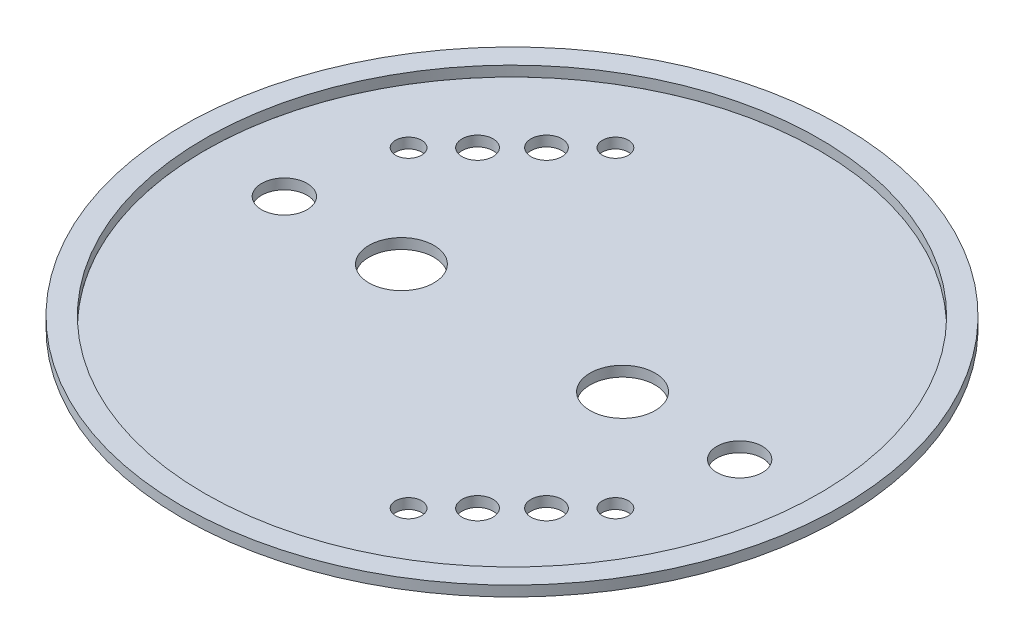
ISO-10303-21;
HEADER;
FILE_DESCRIPTION(('STEP AP214'),'2;1');
FILE_NAME('part.step','',(''),(''),'','','');
FILE_SCHEMA(('AUTOMOTIVE_DESIGN { 1 0 10303 214 1 1 1 1 }'));
ENDSEC;
DATA;
#1=APPLICATION_CONTEXT('core data for automotive mechanical design processes');
#2=APPLICATION_PROTOCOL_DEFINITION('international standard','automotive_design',2000,#1);
#3=PRODUCT_CONTEXT('',#1,'mechanical');
#4=PRODUCT('Part','Part','',(#3));
#5=PRODUCT_RELATED_PRODUCT_CATEGORY('part','',(#4));
#6=PRODUCT_DEFINITION_FORMATION('','',#4);
#7=PRODUCT_DEFINITION_CONTEXT('part definition',#1,'design');
#8=PRODUCT_DEFINITION('design','',#6,#7);
#9=PRODUCT_DEFINITION_SHAPE('','',#8);
#10=(LENGTH_UNIT() NAMED_UNIT(*) SI_UNIT(.MILLI.,.METRE.));
#11=(NAMED_UNIT(*) PLANE_ANGLE_UNIT() SI_UNIT($,.RADIAN.));
#12=(NAMED_UNIT(*) SI_UNIT($,.STERADIAN.) SOLID_ANGLE_UNIT());
#13=UNCERTAINTY_MEASURE_WITH_UNIT(LENGTH_MEASURE(1.E-05),#10,'distance_accuracy_value','');
#14=(GEOMETRIC_REPRESENTATION_CONTEXT(3) GLOBAL_UNCERTAINTY_ASSIGNED_CONTEXT((#13)) GLOBAL_UNIT_ASSIGNED_CONTEXT((#10,
#11,#12)) REPRESENTATION_CONTEXT('',''));
#15=CARTESIAN_POINT('',(0.,0.,0.));
#16=DIRECTION('',(0.,0.,1.));
#17=DIRECTION('',(1.,0.,0.));
#18=AXIS2_PLACEMENT_3D('',#15,#16,#17);
#19=CARTESIAN_POINT('',(0.,15.,0.));
#20=DIRECTION('',(0.,-1.,0.));
#21=DIRECTION('',(0.,0.,-1.));
#22=AXIS2_PLACEMENT_3D('',#19,#20,#21);
#23=CYLINDRICAL_SURFACE('',#22,76.);
#24=CARTESIAN_POINT('',(0.,7.5,0.));
#25=DIRECTION('',(0.,-1.,0.));
#26=DIRECTION('',(0.,0.,-1.));
#27=AXIS2_PLACEMENT_3D('',#24,#25,#26);
#28=CIRCLE('',#27,76.);
#29=CARTESIAN_POINT('',(0.,7.5,-76.));
#30=VERTEX_POINT('',#29);
#31=EDGE_CURVE('E59',#30,#30,#28,.T.);
#32=ORIENTED_EDGE('',*,*,#31,.F.);
#33=EDGE_LOOP('',(#32));
#34=FACE_BOUND('',#33,.T.);
#35=CARTESIAN_POINT('',(0.,9.88,0.));
#36=DIRECTION('',(0.,1.,0.));
#37=DIRECTION('',(0.,0.,1.));
#38=AXIS2_PLACEMENT_3D('',#35,#36,#37);
#39=CIRCLE('',#38,76.);
#40=CARTESIAN_POINT('',(0.,9.88,76.));
#41=VERTEX_POINT('',#40);
#42=EDGE_CURVE('E65',#41,#41,#39,.T.);
#43=ORIENTED_EDGE('',*,*,#42,.F.);
#44=EDGE_LOOP('',(#43));
#45=FACE_BOUND('',#44,.T.);
#46=ADVANCED_FACE('F51',(#34,#45),#23,.T.);
#47=CARTESIAN_POINT('',(0.,7.5,0.));
#48=DIRECTION('',(0.,1.,0.));
#49=DIRECTION('',(0.,0.,1.));
#50=AXIS2_PLACEMENT_3D('',#47,#48,#49);
#51=CYLINDRICAL_SURFACE('',#50,70.875);
#52=CARTESIAN_POINT('',(0.,7.5,0.));
#53=DIRECTION('',(0.,-1.,0.));
#54=DIRECTION('',(0.,0.,-1.));
#55=AXIS2_PLACEMENT_3D('',#52,#53,#54);
#56=CIRCLE('',#55,70.875);
#57=CARTESIAN_POINT('',(0.,7.5,-70.875));
#58=VERTEX_POINT('',#57);
#59=EDGE_CURVE('E11',#58,#58,#56,.T.);
#60=ORIENTED_EDGE('',*,*,#59,.T.);
#61=EDGE_LOOP('',(#60));
#62=FACE_BOUND('',#61,.T.);
#63=CARTESIAN_POINT('',(0.,9.88,0.));
#64=DIRECTION('',(0.,1.,0.));
#65=DIRECTION('',(0.,0.,1.));
#66=AXIS2_PLACEMENT_3D('',#63,#64,#65);
#67=CIRCLE('',#66,70.875);
#68=CARTESIAN_POINT('',(0.,9.88,70.875));
#69=VERTEX_POINT('',#68);
#70=EDGE_CURVE('E55',#69,#69,#67,.F.);
#71=ORIENTED_EDGE('',*,*,#70,.F.);
#72=EDGE_LOOP('',(#71));
#73=FACE_BOUND('',#72,.T.);
#74=ADVANCED_FACE('F74',(#62,#73),#51,.F.);
#75=CARTESIAN_POINT('',(0.,7.5,0.));
#76=DIRECTION('',(0.,-1.,0.));
#77=DIRECTION('',(0.,0.,-1.));
#78=AXIS2_PLACEMENT_3D('',#75,#76,#77);
#79=PLANE('',#78);
#80=ORIENTED_EDGE('',*,*,#59,.F.);
#81=EDGE_LOOP('',(#80));
#82=FACE_BOUND('',#81,.T.);
#83=ORIENTED_EDGE('',*,*,#31,.T.);
#84=EDGE_LOOP('',(#83));
#85=FACE_BOUND('',#84,.T.);
#86=ADVANCED_FACE('F53',(#82,#85),#79,.T.);
#87=CARTESIAN_POINT('',(0.,9.88,0.));
#88=DIRECTION('',(0.,1.,0.));
#89=DIRECTION('',(0.,0.,1.));
#90=AXIS2_PLACEMENT_3D('',#87,#88,#89);
#91=PLANE('',#90);
#92=ORIENTED_EDGE('',*,*,#42,.T.);
#93=EDGE_LOOP('',(#92));
#94=FACE_BOUND('',#93,.T.);
#95=ORIENTED_EDGE('',*,*,#70,.T.);
#96=EDGE_LOOP('',(#95));
#97=FACE_BOUND('',#96,.T.);
#98=ADVANCED_FACE('F72',(#94,#97),#91,.T.);
#99=CLOSED_SHELL('',(#46,#74,#86,#98));
#100=MANIFOLD_SOLID_BREP('B2',#99);
#101=CARTESIAN_POINT('',(0.,7.5,0.));
#102=DIRECTION('',(0.,-1.,0.));
#103=DIRECTION('',(0.,0.,-1.));
#104=AXIS2_PLACEMENT_3D('',#101,#102,#103);
#105=CYLINDRICAL_SURFACE('',#104,70.875);
#106=CARTESIAN_POINT('',(0.,7.5,0.));
#107=DIRECTION('',(0.,-1.,0.));
#108=DIRECTION('',(0.,0.,-1.));
#109=AXIS2_PLACEMENT_3D('',#106,#107,#108);
#110=CIRCLE('',#109,70.875);
#111=CARTESIAN_POINT('',(0.,7.5,-70.875));
#112=VERTEX_POINT('',#111);
#113=EDGE_CURVE('E50',#112,#112,#110,.T.);
#114=ORIENTED_EDGE('',*,*,#113,.T.);
#115=EDGE_LOOP('',(#114));
#116=FACE_BOUND('',#115,.T.);
#117=CARTESIAN_POINT('',(0.,5.12,0.));
#118=DIRECTION('',(0.,-1.,0.));
#119=DIRECTION('',(0.,0.,-1.));
#120=AXIS2_PLACEMENT_3D('',#117,#118,#119);
#121=CIRCLE('',#120,70.875);
#122=CARTESIAN_POINT('',(0.,5.12,-70.875));
#123=VERTEX_POINT('',#122);
#124=EDGE_CURVE('E220',#123,#123,#121,.T.);
#125=ORIENTED_EDGE('',*,*,#124,.F.);
#126=EDGE_LOOP('',(#125));
#127=FACE_BOUND('',#126,.T.);
#128=ADVANCED_FACE('F116',(#116,#127),#105,.T.);
#129=CARTESIAN_POINT('',(-25.5,0.,0.));
#130=DIRECTION('',(0.,1.,0.));
#131=DIRECTION('',(0.,0.,1.));
#132=AXIS2_PLACEMENT_3D('',#129,#130,#131);
#133=CYLINDRICAL_SURFACE('',#132,7.50000000000001);
#134=CARTESIAN_POINT('',(-25.5,7.5,0.));
#135=DIRECTION('',(0.,1.,0.));
#136=DIRECTION('',(0.,0.,1.));
#137=AXIS2_PLACEMENT_3D('',#134,#135,#136);
#138=CIRCLE('',#137,7.50000000000001);
#139=CARTESIAN_POINT('',(-25.5,7.5,7.50000000000001));
#140=VERTEX_POINT('',#139);
#141=EDGE_CURVE('E125',#140,#140,#138,.T.);
#142=ORIENTED_EDGE('',*,*,#141,.T.);
#143=EDGE_LOOP('',(#142));
#144=FACE_BOUND('',#143,.T.);
#145=CARTESIAN_POINT('',(-25.5,5.12,0.));
#146=DIRECTION('',(0.,-1.,0.));
#147=DIRECTION('',(0.,0.,-1.));
#148=AXIS2_PLACEMENT_3D('',#145,#146,#147);
#149=CIRCLE('',#148,7.50000000000001);
#150=CARTESIAN_POINT('',(-25.5,5.12,-7.50000000000001));
#151=VERTEX_POINT('',#150);
#152=EDGE_CURVE('E170',#151,#151,#149,.F.);
#153=ORIENTED_EDGE('',*,*,#152,.F.);
#154=EDGE_LOOP('',(#153));
#155=FACE_BOUND('',#154,.T.);
#156=ADVANCED_FACE('F248',(#144,#155),#133,.F.);
#157=CARTESIAN_POINT('',(24.075,0.,47.925));
#158=DIRECTION('',(0.,1.,0.));
#159=DIRECTION('',(0.,0.,1.));
#160=AXIS2_PLACEMENT_3D('',#157,#158,#159);
#161=CYLINDRICAL_SURFACE('',#160,3.);
#162=CARTESIAN_POINT('',(24.075,7.5,47.925));
#163=DIRECTION('',(0.,1.,0.));
#164=DIRECTION('',(0.,0.,1.));
#165=AXIS2_PLACEMENT_3D('',#162,#163,#164);
#166=CIRCLE('',#165,3.);
#167=CARTESIAN_POINT('',(24.075,7.5,50.925));
#168=VERTEX_POINT('',#167);
#169=EDGE_CURVE('E165',#168,#168,#166,.T.);
#170=ORIENTED_EDGE('',*,*,#169,.T.);
#171=EDGE_LOOP('',(#170));
#172=FACE_BOUND('',#171,.T.);
#173=CARTESIAN_POINT('',(24.075,5.12,47.925));
#174=DIRECTION('',(0.,-1.,0.));
#175=DIRECTION('',(0.,0.,-1.));
#176=AXIS2_PLACEMENT_3D('',#173,#174,#175);
#177=CIRCLE('',#176,3.);
#178=CARTESIAN_POINT('',(24.075,5.12,44.925));
#179=VERTEX_POINT('',#178);
#180=EDGE_CURVE('E180',#179,#179,#177,.F.);
#181=ORIENTED_EDGE('',*,*,#180,.F.);
#182=EDGE_LOOP('',(#181));
#183=FACE_BOUND('',#182,.T.);
#184=ADVANCED_FACE('F252',(#172,#183),#161,.F.);
#185=CARTESIAN_POINT('',(47.925,0.,24.075));
#186=DIRECTION('',(0.,1.,0.));
#187=DIRECTION('',(0.,0.,1.));
#188=AXIS2_PLACEMENT_3D('',#185,#186,#187);
#189=CYLINDRICAL_SURFACE('',#188,3.);
#190=CARTESIAN_POINT('',(47.925,7.5,24.075));
#191=DIRECTION('',(0.,1.,0.));
#192=DIRECTION('',(0.,0.,1.));
#193=AXIS2_PLACEMENT_3D('',#190,#191,#192);
#194=CIRCLE('',#193,3.);
#195=CARTESIAN_POINT('',(47.925,7.5,27.075));
#196=VERTEX_POINT('',#195);
#197=EDGE_CURVE('E169',#196,#196,#194,.T.);
#198=ORIENTED_EDGE('',*,*,#197,.T.);
#199=EDGE_LOOP('',(#198));
#200=FACE_BOUND('',#199,.T.);
#201=CARTESIAN_POINT('',(47.925,5.12,24.075));
#202=DIRECTION('',(0.,-1.,0.));
#203=DIRECTION('',(0.,0.,-1.));
#204=AXIS2_PLACEMENT_3D('',#201,#202,#203);
#205=CIRCLE('',#204,3.);
#206=CARTESIAN_POINT('',(47.925,5.12,21.075));
#207=VERTEX_POINT('',#206);
#208=EDGE_CURVE('E184',#207,#207,#205,.F.);
#209=ORIENTED_EDGE('',*,*,#208,.F.);
#210=EDGE_LOOP('',(#209));
#211=FACE_BOUND('',#210,.T.);
#212=ADVANCED_FACE('F293',(#200,#211),#189,.F.);
#213=CARTESIAN_POINT('',(39.975,0.,32.025));
#214=DIRECTION('',(0.,1.,0.));
#215=DIRECTION('',(0.,0.,1.));
#216=AXIS2_PLACEMENT_3D('',#213,#214,#215);
#217=CYLINDRICAL_SURFACE('',#216,3.57);
#218=CARTESIAN_POINT('',(39.975,7.5,32.025));
#219=DIRECTION('',(0.,1.,0.));
#220=DIRECTION('',(0.,0.,1.));
#221=AXIS2_PLACEMENT_3D('',#218,#219,#220);
#222=CIRCLE('',#221,3.57);
#223=CARTESIAN_POINT('',(39.975,7.5,35.595));
#224=VERTEX_POINT('',#223);
#225=EDGE_CURVE('E154',#224,#224,#222,.T.);
#226=ORIENTED_EDGE('',*,*,#225,.T.);
#227=EDGE_LOOP('',(#226));
#228=FACE_BOUND('',#227,.T.);
#229=CARTESIAN_POINT('',(39.975,5.12,32.025));
#230=DIRECTION('',(0.,-1.,0.));
#231=DIRECTION('',(0.,0.,-1.));
#232=AXIS2_PLACEMENT_3D('',#229,#230,#231);
#233=CIRCLE('',#232,3.57);
#234=CARTESIAN_POINT('',(39.975,5.12,28.455));
#235=VERTEX_POINT('',#234);
#236=EDGE_CURVE('E188',#235,#235,#233,.F.);
#237=ORIENTED_EDGE('',*,*,#236,.F.);
#238=EDGE_LOOP('',(#237));
#239=FACE_BOUND('',#238,.T.);
#240=ADVANCED_FACE('F269',(#228,#239),#217,.F.);
#241=CARTESIAN_POINT('',(-32.025,0.,-39.975));
#242=DIRECTION('',(0.,1.,0.));
#243=DIRECTION('',(0.,0.,1.));
#244=AXIS2_PLACEMENT_3D('',#241,#242,#243);
#245=CYLINDRICAL_SURFACE('',#244,3.57);
#246=CARTESIAN_POINT('',(-32.025,7.5,-39.975));
#247=DIRECTION('',(0.,1.,0.));
#248=DIRECTION('',(0.,0.,1.));
#249=AXIS2_PLACEMENT_3D('',#246,#247,#248);
#250=CIRCLE('',#249,3.57);
#251=CARTESIAN_POINT('',(-32.025,7.5,-36.405));
#252=VERTEX_POINT('',#251);
#253=EDGE_CURVE('E141',#252,#252,#250,.T.);
#254=ORIENTED_EDGE('',*,*,#253,.T.);
#255=EDGE_LOOP('',(#254));
#256=FACE_BOUND('',#255,.T.);
#257=CARTESIAN_POINT('',(-32.025,5.12,-39.975));
#258=DIRECTION('',(0.,-1.,0.));
#259=DIRECTION('',(0.,0.,-1.));
#260=AXIS2_PLACEMENT_3D('',#257,#258,#259);
#261=CIRCLE('',#260,3.57);
#262=CARTESIAN_POINT('',(-32.025,5.12,-43.545));
#263=VERTEX_POINT('',#262);
#264=EDGE_CURVE('E192',#263,#263,#261,.F.);
#265=ORIENTED_EDGE('',*,*,#264,.F.);
#266=EDGE_LOOP('',(#265));
#267=FACE_BOUND('',#266,.T.);
#268=ADVANCED_FACE('F267',(#256,#267),#245,.F.);
#269=CARTESIAN_POINT('',(52.5,0.,0.));
#270=DIRECTION('',(0.,1.,0.));
#271=DIRECTION('',(0.,0.,1.));
#272=AXIS2_PLACEMENT_3D('',#269,#270,#271);
#273=CYLINDRICAL_SURFACE('',#272,5.25);
#274=CARTESIAN_POINT('',(52.5,7.5,0.));
#275=DIRECTION('',(0.,1.,0.));
#276=DIRECTION('',(0.,0.,1.));
#277=AXIS2_PLACEMENT_3D('',#274,#275,#276);
#278=CIRCLE('',#277,5.25);
#279=CARTESIAN_POINT('',(52.5,7.5,5.25));
#280=VERTEX_POINT('',#279);
#281=EDGE_CURVE('E137',#280,#280,#278,.T.);
#282=ORIENTED_EDGE('',*,*,#281,.T.);
#283=EDGE_LOOP('',(#282));
#284=FACE_BOUND('',#283,.T.);
#285=CARTESIAN_POINT('',(52.5,5.12,0.));
#286=DIRECTION('',(0.,-1.,0.));
#287=DIRECTION('',(0.,0.,-1.));
#288=AXIS2_PLACEMENT_3D('',#285,#286,#287);
#289=CIRCLE('',#288,5.25);
#290=CARTESIAN_POINT('',(52.5,5.12,-5.25));
#291=VERTEX_POINT('',#290);
#292=EDGE_CURVE('E196',#291,#291,#289,.F.);
#293=ORIENTED_EDGE('',*,*,#292,.F.);
#294=EDGE_LOOP('',(#293));
#295=FACE_BOUND('',#294,.T.);
#296=ADVANCED_FACE('F261',(#284,#295),#273,.F.);
#297=CARTESIAN_POINT('',(25.5,0.,0.));
#298=DIRECTION('',(0.,1.,0.));
#299=DIRECTION('',(0.,0.,1.));
#300=AXIS2_PLACEMENT_3D('',#297,#298,#299);
#301=CYLINDRICAL_SURFACE('',#300,7.5);
#302=CARTESIAN_POINT('',(25.5,7.5,0.));
#303=DIRECTION('',(0.,1.,0.));
#304=DIRECTION('',(0.,0.,1.));
#305=AXIS2_PLACEMENT_3D('',#302,#303,#304);
#306=CIRCLE('',#305,7.5);
#307=CARTESIAN_POINT('',(25.5,7.5,7.5));
#308=VERTEX_POINT('',#307);
#309=EDGE_CURVE('E133',#308,#308,#306,.T.);
#310=ORIENTED_EDGE('',*,*,#309,.T.);
#311=EDGE_LOOP('',(#310));
#312=FACE_BOUND('',#311,.T.);
#313=CARTESIAN_POINT('',(25.5,5.12,0.));
#314=DIRECTION('',(0.,-1.,0.));
#315=DIRECTION('',(0.,0.,-1.));
#316=AXIS2_PLACEMENT_3D('',#313,#314,#315);
#317=CIRCLE('',#316,7.5);
#318=CARTESIAN_POINT('',(25.5,5.12,-7.5));
#319=VERTEX_POINT('',#318);
#320=EDGE_CURVE('E200',#319,#319,#317,.F.);
#321=ORIENTED_EDGE('',*,*,#320,.F.);
#322=EDGE_LOOP('',(#321));
#323=FACE_BOUND('',#322,.T.);
#324=ADVANCED_FACE('F257',(#312,#323),#301,.F.);
#325=CARTESIAN_POINT('',(-52.5,0.,0.));
#326=DIRECTION('',(0.,1.,0.));
#327=DIRECTION('',(0.,0.,1.));
#328=AXIS2_PLACEMENT_3D('',#325,#326,#327);
#329=CYLINDRICAL_SURFACE('',#328,5.25);
#330=CARTESIAN_POINT('',(-52.5,7.5,0.));
#331=DIRECTION('',(0.,1.,0.));
#332=DIRECTION('',(0.,0.,1.));
#333=AXIS2_PLACEMENT_3D('',#330,#331,#332);
#334=CIRCLE('',#333,5.25);
#335=CARTESIAN_POINT('',(-52.5,7.5,5.25));
#336=VERTEX_POINT('',#335);
#337=EDGE_CURVE('E130',#336,#336,#334,.T.);
#338=ORIENTED_EDGE('',*,*,#337,.T.);
#339=EDGE_LOOP('',(#338));
#340=FACE_BOUND('',#339,.T.);
#341=CARTESIAN_POINT('',(-52.5,5.12,0.));
#342=DIRECTION('',(0.,-1.,0.));
#343=DIRECTION('',(0.,0.,-1.));
#344=AXIS2_PLACEMENT_3D('',#341,#342,#343);
#345=CIRCLE('',#344,5.25);
#346=CARTESIAN_POINT('',(-52.5,5.12,-5.25));
#347=VERTEX_POINT('',#346);
#348=EDGE_CURVE('E204',#347,#347,#345,.F.);
#349=ORIENTED_EDGE('',*,*,#348,.F.);
#350=EDGE_LOOP('',(#349));
#351=FACE_BOUND('',#350,.T.);
#352=ADVANCED_FACE('F260',(#340,#351),#329,.F.);
#353=CARTESIAN_POINT('',(-39.975,0.,-32.025));
#354=DIRECTION('',(0.,1.,0.));
#355=DIRECTION('',(0.,0.,1.));
#356=AXIS2_PLACEMENT_3D('',#353,#354,#355);
#357=CYLINDRICAL_SURFACE('',#356,3.57);
#358=CARTESIAN_POINT('',(-39.975,7.5,-32.025));
#359=DIRECTION('',(0.,1.,0.));
#360=DIRECTION('',(0.,0.,1.));
#361=AXIS2_PLACEMENT_3D('',#358,#359,#360);
#362=CIRCLE('',#361,3.57);
#363=CARTESIAN_POINT('',(-39.975,7.5,-28.455));
#364=VERTEX_POINT('',#363);
#365=EDGE_CURVE('E145',#364,#364,#362,.T.);
#366=ORIENTED_EDGE('',*,*,#365,.T.);
#367=EDGE_LOOP('',(#366));
#368=FACE_BOUND('',#367,.T.);
#369=CARTESIAN_POINT('',(-39.975,5.12,-32.025));
#370=DIRECTION('',(0.,-1.,0.));
#371=DIRECTION('',(0.,0.,-1.));
#372=AXIS2_PLACEMENT_3D('',#369,#370,#371);
#373=CIRCLE('',#372,3.57);
#374=CARTESIAN_POINT('',(-39.975,5.12,-35.595));
#375=VERTEX_POINT('',#374);
#376=EDGE_CURVE('E208',#375,#375,#373,.F.);
#377=ORIENTED_EDGE('',*,*,#376,.F.);
#378=EDGE_LOOP('',(#377));
#379=FACE_BOUND('',#378,.T.);
#380=ADVANCED_FACE('F265',(#368,#379),#357,.F.);
#381=CARTESIAN_POINT('',(-47.925,0.,-24.075));
#382=DIRECTION('',(0.,1.,0.));
#383=DIRECTION('',(0.,0.,1.));
#384=AXIS2_PLACEMENT_3D('',#381,#382,#383);
#385=CYLINDRICAL_SURFACE('',#384,3.);
#386=CARTESIAN_POINT('',(-47.925,7.5,-24.075));
#387=DIRECTION('',(0.,1.,0.));
#388=DIRECTION('',(0.,0.,1.));
#389=AXIS2_PLACEMENT_3D('',#386,#387,#388);
#390=CIRCLE('',#389,3.);
#391=CARTESIAN_POINT('',(-47.925,7.5,-21.075));
#392=VERTEX_POINT('',#391);
#393=EDGE_CURVE('E158',#392,#392,#390,.T.);
#394=ORIENTED_EDGE('',*,*,#393,.T.);
#395=EDGE_LOOP('',(#394));
#396=FACE_BOUND('',#395,.T.);
#397=CARTESIAN_POINT('',(-47.925,5.12,-24.075));
#398=DIRECTION('',(0.,-1.,0.));
#399=DIRECTION('',(0.,0.,-1.));
#400=AXIS2_PLACEMENT_3D('',#397,#398,#399);
#401=CIRCLE('',#400,3.);
#402=CARTESIAN_POINT('',(-47.925,5.12,-27.075));
#403=VERTEX_POINT('',#402);
#404=EDGE_CURVE('E212',#403,#403,#401,.F.);
#405=ORIENTED_EDGE('',*,*,#404,.F.);
#406=EDGE_LOOP('',(#405));
#407=FACE_BOUND('',#406,.T.);
#408=ADVANCED_FACE('F243',(#396,#407),#385,.F.);
#409=CARTESIAN_POINT('',(-24.075,0.,-47.925));
#410=DIRECTION('',(0.,1.,0.));
#411=DIRECTION('',(0.,0.,1.));
#412=AXIS2_PLACEMENT_3D('',#409,#410,#411);
#413=CYLINDRICAL_SURFACE('',#412,3.);
#414=CARTESIAN_POINT('',(-24.075,7.5,-47.925));
#415=DIRECTION('',(0.,1.,0.));
#416=DIRECTION('',(0.,0.,1.));
#417=AXIS2_PLACEMENT_3D('',#414,#415,#416);
#418=CIRCLE('',#417,3.);
#419=CARTESIAN_POINT('',(-24.075,7.5,-44.925));
#420=VERTEX_POINT('',#419);
#421=EDGE_CURVE('E153',#420,#420,#418,.T.);
#422=ORIENTED_EDGE('',*,*,#421,.T.);
#423=EDGE_LOOP('',(#422));
#424=FACE_BOUND('',#423,.T.);
#425=CARTESIAN_POINT('',(-24.075,5.12,-47.925));
#426=DIRECTION('',(0.,-1.,0.));
#427=DIRECTION('',(0.,0.,-1.));
#428=AXIS2_PLACEMENT_3D('',#425,#426,#427);
#429=CIRCLE('',#428,3.);
#430=CARTESIAN_POINT('',(-24.075,5.12,-50.925));
#431=VERTEX_POINT('',#430);
#432=EDGE_CURVE('E216',#431,#431,#429,.F.);
#433=ORIENTED_EDGE('',*,*,#432,.F.);
#434=EDGE_LOOP('',(#433));
#435=FACE_BOUND('',#434,.T.);
#436=ADVANCED_FACE('F234',(#424,#435),#413,.F.);
#437=CARTESIAN_POINT('',(32.025,0.,39.975));
#438=DIRECTION('',(0.,1.,0.));
#439=DIRECTION('',(0.,0.,1.));
#440=AXIS2_PLACEMENT_3D('',#437,#438,#439);
#441=CYLINDRICAL_SURFACE('',#440,3.57);
#442=CARTESIAN_POINT('',(32.025,7.5,39.975));
#443=DIRECTION('',(0.,1.,0.));
#444=DIRECTION('',(0.,0.,1.));
#445=AXIS2_PLACEMENT_3D('',#442,#443,#444);
#446=CIRCLE('',#445,3.57);
#447=CARTESIAN_POINT('',(32.025,7.5,43.545));
#448=VERTEX_POINT('',#447);
#449=EDGE_CURVE('E149',#448,#448,#446,.T.);
#450=ORIENTED_EDGE('',*,*,#449,.T.);
#451=EDGE_LOOP('',(#450));
#452=FACE_BOUND('',#451,.T.);
#453=CARTESIAN_POINT('',(32.025,5.12,39.975));
#454=DIRECTION('',(0.,-1.,0.));
#455=DIRECTION('',(0.,0.,-1.));
#456=AXIS2_PLACEMENT_3D('',#453,#454,#455);
#457=CIRCLE('',#456,3.57);
#458=CARTESIAN_POINT('',(32.025,5.12,36.405));
#459=VERTEX_POINT('',#458);
#460=EDGE_CURVE('E120',#459,#459,#457,.F.);
#461=ORIENTED_EDGE('',*,*,#460,.F.);
#462=EDGE_LOOP('',(#461));
#463=FACE_BOUND('',#462,.T.);
#464=ADVANCED_FACE('F232',(#452,#463),#441,.F.);
#465=CARTESIAN_POINT('',(0.,7.5,0.));
#466=DIRECTION('',(0.,1.,0.));
#467=DIRECTION('',(0.,0.,1.));
#468=AXIS2_PLACEMENT_3D('',#465,#466,#467);
#469=PLANE('',#468);
#470=ORIENTED_EDGE('',*,*,#449,.F.);
#471=EDGE_LOOP('',(#470));
#472=FACE_BOUND('',#471,.T.);
#473=ORIENTED_EDGE('',*,*,#421,.F.);
#474=EDGE_LOOP('',(#473));
#475=FACE_BOUND('',#474,.T.);
#476=ORIENTED_EDGE('',*,*,#393,.F.);
#477=EDGE_LOOP('',(#476));
#478=FACE_BOUND('',#477,.T.);
#479=ORIENTED_EDGE('',*,*,#365,.F.);
#480=EDGE_LOOP('',(#479));
#481=FACE_BOUND('',#480,.T.);
#482=ORIENTED_EDGE('',*,*,#337,.F.);
#483=EDGE_LOOP('',(#482));
#484=FACE_BOUND('',#483,.T.);
#485=ORIENTED_EDGE('',*,*,#309,.F.);
#486=EDGE_LOOP('',(#485));
#487=FACE_BOUND('',#486,.T.);
#488=ORIENTED_EDGE('',*,*,#281,.F.);
#489=EDGE_LOOP('',(#488));
#490=FACE_BOUND('',#489,.T.);
#491=ORIENTED_EDGE('',*,*,#253,.F.);
#492=EDGE_LOOP('',(#491));
#493=FACE_BOUND('',#492,.T.);
#494=ORIENTED_EDGE('',*,*,#225,.F.);
#495=EDGE_LOOP('',(#494));
#496=FACE_BOUND('',#495,.T.);
#497=ORIENTED_EDGE('',*,*,#197,.F.);
#498=EDGE_LOOP('',(#497));
#499=FACE_BOUND('',#498,.T.);
#500=ORIENTED_EDGE('',*,*,#169,.F.);
#501=EDGE_LOOP('',(#500));
#502=FACE_BOUND('',#501,.T.);
#503=ORIENTED_EDGE('',*,*,#141,.F.);
#504=EDGE_LOOP('',(#503));
#505=FACE_BOUND('',#504,.T.);
#506=ORIENTED_EDGE('',*,*,#113,.F.);
#507=EDGE_LOOP('',(#506));
#508=FACE_BOUND('',#507,.T.);
#509=ADVANCED_FACE('F118',(#472,#475,#478,#481,#484,#487,#490,#493,#496,#499,#502,#505,#508),
#469,.T.);
#510=CARTESIAN_POINT('',(0.,5.12,0.));
#511=DIRECTION('',(0.,-1.,0.));
#512=DIRECTION('',(0.,0.,-1.));
#513=AXIS2_PLACEMENT_3D('',#510,#511,#512);
#514=PLANE('',#513);
#515=ORIENTED_EDGE('',*,*,#124,.T.);
#516=EDGE_LOOP('',(#515));
#517=FACE_BOUND('',#516,.T.);
#518=ORIENTED_EDGE('',*,*,#460,.T.);
#519=EDGE_LOOP('',(#518));
#520=FACE_BOUND('',#519,.T.);
#521=ORIENTED_EDGE('',*,*,#432,.T.);
#522=EDGE_LOOP('',(#521));
#523=FACE_BOUND('',#522,.T.);
#524=ORIENTED_EDGE('',*,*,#404,.T.);
#525=EDGE_LOOP('',(#524));
#526=FACE_BOUND('',#525,.T.);
#527=ORIENTED_EDGE('',*,*,#376,.T.);
#528=EDGE_LOOP('',(#527));
#529=FACE_BOUND('',#528,.T.);
#530=ORIENTED_EDGE('',*,*,#348,.T.);
#531=EDGE_LOOP('',(#530));
#532=FACE_BOUND('',#531,.T.);
#533=ORIENTED_EDGE('',*,*,#320,.T.);
#534=EDGE_LOOP('',(#533));
#535=FACE_BOUND('',#534,.T.);
#536=ORIENTED_EDGE('',*,*,#292,.T.);
#537=EDGE_LOOP('',(#536));
#538=FACE_BOUND('',#537,.T.);
#539=ORIENTED_EDGE('',*,*,#264,.T.);
#540=EDGE_LOOP('',(#539));
#541=FACE_BOUND('',#540,.T.);
#542=ORIENTED_EDGE('',*,*,#236,.T.);
#543=EDGE_LOOP('',(#542));
#544=FACE_BOUND('',#543,.T.);
#545=ORIENTED_EDGE('',*,*,#208,.T.);
#546=EDGE_LOOP('',(#545));
#547=FACE_BOUND('',#546,.T.);
#548=ORIENTED_EDGE('',*,*,#180,.T.);
#549=EDGE_LOOP('',(#548));
#550=FACE_BOUND('',#549,.T.);
#551=ORIENTED_EDGE('',*,*,#152,.T.);
#552=EDGE_LOOP('',(#551));
#553=FACE_BOUND('',#552,.T.);
#554=ADVANCED_FACE('F229',(#517,#520,#523,#526,#529,#532,#535,#538,#541,#544,#547,#550,#553),
#514,.T.);
#555=CLOSED_SHELL('',(#128,#156,#184,#212,#240,#268,#296,#324,#352,#380,#408,#436,#464,#509,#554));
#556=MANIFOLD_SOLID_BREP('B6',#555);
#557=ADVANCED_BREP_SHAPE_REPRESENTATION('',(#18,#100,#556),#14);
#558=SHAPE_DEFINITION_REPRESENTATION(#9,#557);
ENDSEC;
END-ISO-10303-21;
